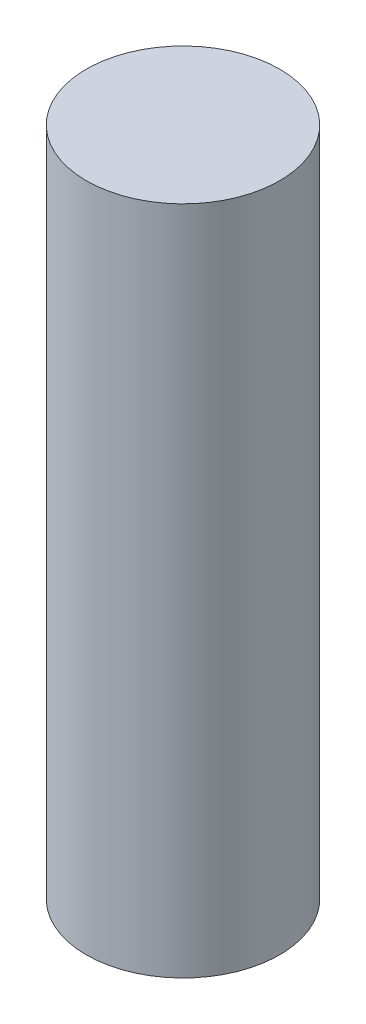
ISO-10303-21;
HEADER;
FILE_DESCRIPTION(('STEP AP214'),'2;1');
FILE_NAME('part.step','',(''),(''),'','','');
FILE_SCHEMA(('AUTOMOTIVE_DESIGN { 1 0 10303 214 1 1 1 1 }'));
ENDSEC;
DATA;
#1=APPLICATION_CONTEXT('core data for automotive mechanical design processes');
#2=APPLICATION_PROTOCOL_DEFINITION('international standard','automotive_design',2000,#1);
#3=PRODUCT_CONTEXT('',#1,'mechanical');
#4=PRODUCT('Part','Part','',(#3));
#5=PRODUCT_RELATED_PRODUCT_CATEGORY('part','',(#4));
#6=PRODUCT_DEFINITION_FORMATION('','',#4);
#7=PRODUCT_DEFINITION_CONTEXT('part definition',#1,'design');
#8=PRODUCT_DEFINITION('design','',#6,#7);
#9=PRODUCT_DEFINITION_SHAPE('','',#8);
#10=(LENGTH_UNIT() NAMED_UNIT(*) SI_UNIT(.MILLI.,.METRE.));
#11=(NAMED_UNIT(*) PLANE_ANGLE_UNIT() SI_UNIT($,.RADIAN.));
#12=(NAMED_UNIT(*) SI_UNIT($,.STERADIAN.) SOLID_ANGLE_UNIT());
#13=UNCERTAINTY_MEASURE_WITH_UNIT(LENGTH_MEASURE(1.E-05),#10,'distance_accuracy_value','');
#14=(GEOMETRIC_REPRESENTATION_CONTEXT(3) GLOBAL_UNCERTAINTY_ASSIGNED_CONTEXT((#13)) GLOBAL_UNIT_ASSIGNED_CONTEXT((#10,
#11,#12)) REPRESENTATION_CONTEXT('',''));
#15=CARTESIAN_POINT('',(0.,0.,0.));
#16=DIRECTION('',(0.,0.,1.));
#17=DIRECTION('',(1.,0.,0.));
#18=AXIS2_PLACEMENT_3D('',#15,#16,#17);
#19=CARTESIAN_POINT('',(0.,19.812,0.));
#20=DIRECTION('',(0.,-1.,0.));
#21=DIRECTION('',(0.,0.,-1.));
#22=AXIS2_PLACEMENT_3D('',#19,#20,#21);
#23=CYLINDRICAL_SURFACE('',#22,2.8575);
#24=CARTESIAN_POINT('',(0.,19.812,0.));
#25=DIRECTION('',(0.,1.,0.));
#26=DIRECTION('',(0.,0.,1.));
#27=AXIS2_PLACEMENT_3D('',#24,#25,#26);
#28=CIRCLE('',#27,2.8575);
#29=CARTESIAN_POINT('',(0.,19.812,2.8575));
#30=VERTEX_POINT('',#29);
#31=EDGE_CURVE('E10',#30,#30,#28,.T.);
#32=ORIENTED_EDGE('',*,*,#31,.F.);
#33=EDGE_LOOP('',(#32));
#34=FACE_BOUND('',#33,.T.);
#35=CARTESIAN_POINT('',(0.,0.,0.));
#36=DIRECTION('',(0.,1.,0.));
#37=DIRECTION('',(0.,0.,1.));
#38=AXIS2_PLACEMENT_3D('',#35,#36,#37);
#39=CIRCLE('',#38,2.8575);
#40=CARTESIAN_POINT('',(0.,0.,2.8575));
#41=VERTEX_POINT('',#40);
#42=EDGE_CURVE('E43',#41,#41,#39,.T.);
#43=ORIENTED_EDGE('',*,*,#42,.T.);
#44=EDGE_LOOP('',(#43));
#45=FACE_BOUND('',#44,.T.);
#46=ADVANCED_FACE('F40',(#34,#45),#23,.T.);
#47=CARTESIAN_POINT('',(0.,19.812,0.));
#48=DIRECTION('',(0.,1.,0.));
#49=DIRECTION('',(0.,0.,1.));
#50=AXIS2_PLACEMENT_3D('',#47,#48,#49);
#51=PLANE('',#50);
#52=ORIENTED_EDGE('',*,*,#31,.T.);
#53=EDGE_LOOP('',(#52));
#54=FACE_BOUND('',#53,.T.);
#55=ADVANCED_FACE('F55',(#54),#51,.T.);
#56=CARTESIAN_POINT('',(0.,0.,0.));
#57=DIRECTION('',(0.,1.,0.));
#58=DIRECTION('',(0.,0.,1.));
#59=AXIS2_PLACEMENT_3D('',#56,#57,#58);
#60=PLANE('',#59);
#61=ORIENTED_EDGE('',*,*,#42,.F.);
#62=EDGE_LOOP('',(#61));
#63=FACE_BOUND('',#62,.T.);
#64=ADVANCED_FACE('F53',(#63),#60,.F.);
#65=CLOSED_SHELL('',(#46,#55,#64));
#66=MANIFOLD_SOLID_BREP('B2',#65);
#67=ADVANCED_BREP_SHAPE_REPRESENTATION('',(#18,#66),#14);
#68=SHAPE_DEFINITION_REPRESENTATION(#9,#67);
ENDSEC;
END-ISO-10303-21;
